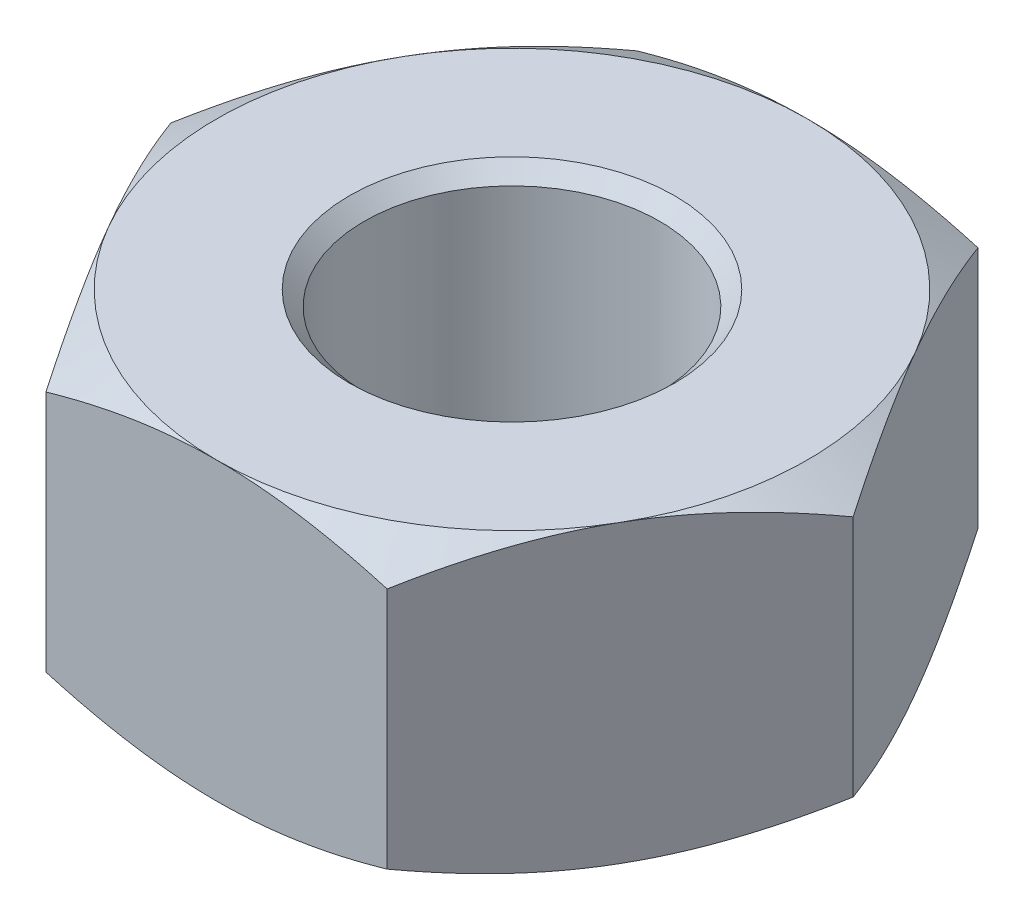
ISO-10303-21;
HEADER;
FILE_DESCRIPTION(('STEP AP214'),'2;1');
FILE_NAME('part.step','',(''),(''),'','','');
FILE_SCHEMA(('AUTOMOTIVE_DESIGN { 1 0 10303 214 1 1 1 1 }'));
ENDSEC;
DATA;
#1=APPLICATION_CONTEXT('core data for automotive mechanical design processes');
#2=APPLICATION_PROTOCOL_DEFINITION('international standard','automotive_design',2000,#1);
#3=PRODUCT_CONTEXT('',#1,'mechanical');
#4=PRODUCT('Part','Part','',(#3));
#5=PRODUCT_RELATED_PRODUCT_CATEGORY('part','',(#4));
#6=PRODUCT_DEFINITION_FORMATION('','',#4);
#7=PRODUCT_DEFINITION_CONTEXT('part definition',#1,'design');
#8=PRODUCT_DEFINITION('design','',#6,#7);
#9=PRODUCT_DEFINITION_SHAPE('','',#8);
#10=(LENGTH_UNIT() NAMED_UNIT(*) SI_UNIT(.MILLI.,.METRE.));
#11=(NAMED_UNIT(*) PLANE_ANGLE_UNIT() SI_UNIT($,.RADIAN.));
#12=(NAMED_UNIT(*) SI_UNIT($,.STERADIAN.) SOLID_ANGLE_UNIT());
#13=UNCERTAINTY_MEASURE_WITH_UNIT(LENGTH_MEASURE(1.E-05),#10,'distance_accuracy_value','');
#14=(GEOMETRIC_REPRESENTATION_CONTEXT(3) GLOBAL_UNCERTAINTY_ASSIGNED_CONTEXT((#13)) GLOBAL_UNIT_ASSIGNED_CONTEXT((#10,
#11,#12)) REPRESENTATION_CONTEXT('',''));
#15=CARTESIAN_POINT('',(0.,0.,0.));
#16=DIRECTION('',(0.,0.,1.));
#17=DIRECTION('',(1.,0.,0.));
#18=AXIS2_PLACEMENT_3D('',#15,#16,#17);
#19=CARTESIAN_POINT('',(0.,1.5,0.));
#20=DIRECTION('',(0.,1.,0.));
#21=DIRECTION('',(0.,0.,1.));
#22=AXIS2_PLACEMENT_3D('',#19,#20,#21);
#23=PLANE('',#22);
#24=CARTESIAN_POINT('',(0.,1.5,0.));
#25=DIRECTION('',(0.,1.,0.));
#26=DIRECTION('',(0.,0.,1.));
#27=AXIS2_PLACEMENT_3D('',#24,#25,#26);
#28=CIRCLE('',#27,0.824999999999999);
#29=CARTESIAN_POINT('',(0.,1.5,0.824999999999999));
#30=VERTEX_POINT('',#29);
#31=EDGE_CURVE('E12',#30,#30,#28,.F.);
#32=ORIENTED_EDGE('',*,*,#31,.T.);
#33=EDGE_LOOP('',(#32));
#34=FACE_BOUND('',#33,.T.);
#35=CARTESIAN_POINT('',(0.,1.5,0.));
#36=DIRECTION('',(0.,1.,0.));
#37=DIRECTION('',(0.,0.,1.));
#38=AXIS2_PLACEMENT_3D('',#35,#36,#37);
#39=CIRCLE('',#38,1.5);
#40=CARTESIAN_POINT('',(-1.29903810567666,1.5,0.750000000000001));
#41=VERTEX_POINT('',#40);
#42=CARTESIAN_POINT('',(0.,1.5,1.5));
#43=VERTEX_POINT('',#42);
#44=EDGE_CURVE('E158',#41,#43,#39,.T.);
#45=ORIENTED_EDGE('',*,*,#44,.T.);
#46=CARTESIAN_POINT('',(1.29903810567666,1.5,0.75));
#47=VERTEX_POINT('',#46);
#48=EDGE_CURVE('E139',#43,#47,#39,.T.);
#49=ORIENTED_EDGE('',*,*,#48,.T.);
#50=CARTESIAN_POINT('',(1.29903810567666,1.5,-0.750000000000001));
#51=VERTEX_POINT('',#50);
#52=EDGE_CURVE('E129',#47,#51,#39,.T.);
#53=ORIENTED_EDGE('',*,*,#52,.T.);
#54=CARTESIAN_POINT('',(0.,1.5,-1.5));
#55=VERTEX_POINT('',#54);
#56=EDGE_CURVE('E55',#51,#55,#39,.T.);
#57=ORIENTED_EDGE('',*,*,#56,.T.);
#58=CARTESIAN_POINT('',(-1.29903810567666,1.5,-0.75));
#59=VERTEX_POINT('',#58);
#60=EDGE_CURVE('E63',#55,#59,#39,.T.);
#61=ORIENTED_EDGE('',*,*,#60,.T.);
#62=EDGE_CURVE('E162',#59,#41,#39,.T.);
#63=ORIENTED_EDGE('',*,*,#62,.T.);
#64=EDGE_LOOP('',(#45,#49,#53,#57,#61,#63));
#65=FACE_BOUND('',#64,.T.);
#66=ADVANCED_FACE('F39',(#34,#65),#23,.T.);
#67=CARTESIAN_POINT('',(0.866025403784439,1.5,1.5));
#68=DIRECTION('',(-0.866025403784439,0.,-0.5));
#69=DIRECTION('',(-0.5,0.,0.866025403784439));
#70=AXIS2_PLACEMENT_3D('',#67,#68,#69);
#71=PLANE('',#70);
#72=CARTESIAN_POINT('',(0.865909933730601,1.36595873045155,1.5002));
#73=CARTESIAN_POINT('',(0.903968454193446,1.38794254723082,1.43428070889745));
#74=CARTESIAN_POINT('',(0.942355490953073,1.40793651431818,1.36779241087777));
#75=CARTESIAN_POINT('',(1.01979436916421,1.44283730281549,1.23366433933493));
#76=CARTESIAN_POINT('',(1.05884758728358,1.45773177567683,1.16602218135312));
#77=CARTESIAN_POINT('',(1.13646999803241,1.48091872268976,1.03157622213016));
#78=CARTESIAN_POINT('',(1.17502724286933,1.48936549228819,0.964793115072754));
#79=CARTESIAN_POINT('',(1.25232329150577,1.49945182648815,0.830912431610121));
#80=CARTESIAN_POINT('',(1.29106181408333,1.50109974064211,0.763815342295623));
#81=CARTESIAN_POINT('',(1.363455807133,1.4976837809469,0.638425268170805));
#82=CARTESIAN_POINT('',(1.39712207785428,1.49345864477602,0.580113576780181));
#83=CARTESIAN_POINT('',(1.46423526865157,1.48006362856733,0.463870120461218));
#84=CARTESIAN_POINT('',(1.49768195634505,1.47088916638415,0.405938758031215));
#85=CARTESIAN_POINT('',(1.56493368410116,1.44795222004501,0.289455348660848));
#86=CARTESIAN_POINT('',(1.59873020609217,1.43409244183855,0.230918055453308));
#87=CARTESIAN_POINT('',(1.6658189879754,1.40263561976334,0.11471687661364));
#88=CARTESIAN_POINT('',(1.699112108342,1.38504597411039,0.0570515005961889));
#89=CARTESIAN_POINT('',(1.73216627762272,1.36595873045155,-0.000200000000000637));
#90=B_SPLINE_CURVE_WITH_KNOTS('',3,(#72,#73,#74,#75,#76,#77,#78,#79,#80,#81,#82,#83,#84,#85,#86,
#87,#88,#89),.UNSPECIFIED.,.F.,.F.,(4,2,2,2,2,2,2,2,4),(0.,0.237777822177384,0.476127422841919,
0.70857706723059,0.940741159251581,1.14294352835891,1.34533342091876,1.55221450553907,
1.75868901573748),.UNSPECIFIED.);
#91=CARTESIAN_POINT('',(0.86602540378444,1.36602540378444,1.5));
#92=VERTEX_POINT('',#91);
#93=EDGE_CURVE('E144',#92,#47,#90,.T.);
#94=ORIENTED_EDGE('',*,*,#93,.F.);
#95=DIRECTION('',(0.,-1.,0.));
#96=VECTOR('',#95,1.);
#97=CARTESIAN_POINT('',(0.866025403784439,1.5,1.5));
#98=LINE('',#97,#96);
#99=CARTESIAN_POINT('',(0.866025403784439,0.133974596215562,1.5));
#100=VERTEX_POINT('',#99);
#101=EDGE_CURVE('E355',#92,#100,#98,.T.);
#102=ORIENTED_EDGE('',*,*,#101,.T.);
#103=CARTESIAN_POINT('',(0.865909933730601,0.13404126954845,1.5002));
#104=CARTESIAN_POINT('',(0.903968454193446,0.112057452769178,1.43428070889745));
#105=CARTESIAN_POINT('',(0.942355490953073,0.0920634856818228,1.36779241087777));
#106=CARTESIAN_POINT('',(1.01979436916421,0.0571626971845069,1.23366433933493));
#107=CARTESIAN_POINT('',(1.05884758728358,0.042268224323167,1.16602218135312));
#108=CARTESIAN_POINT('',(1.13646999803241,0.0190812773102432,1.03157622213016));
#109=CARTESIAN_POINT('',(1.17502724286933,0.0106345077118148,0.964793115072754));
#110=CARTESIAN_POINT('',(1.25232329150577,0.00054817351185309,0.830912431610121));
#111=CARTESIAN_POINT('',(1.29106181408333,-0.00109974064210923,0.763815342295623));
#112=CARTESIAN_POINT('',(1.363455807133,0.00231621905310439,0.638425268170805));
#113=CARTESIAN_POINT('',(1.39712207785428,0.00654135522397997,0.580113576780181));
#114=CARTESIAN_POINT('',(1.46423526865157,0.019936371432671,0.463870120461218));
#115=CARTESIAN_POINT('',(1.49768195634505,0.029110833615848,0.405938758031215));
#116=CARTESIAN_POINT('',(1.56493368410116,0.0520477799549944,0.289455348660848));
#117=CARTESIAN_POINT('',(1.59873020609217,0.0659075581614456,0.230918055453308));
#118=CARTESIAN_POINT('',(1.6658189879754,0.0973643802366553,0.11471687661364));
#119=CARTESIAN_POINT('',(1.699112108342,0.114954025889615,0.0570515005961888));
#120=CARTESIAN_POINT('',(1.73216627762272,0.13404126954845,-0.000200000000000631));
#121=B_SPLINE_CURVE_WITH_KNOTS('',3,(#103,#104,#105,#106,#107,#108,#109,#110,#111,#112,#113,
#114,#115,#116,#117,#118,#119,#120),.UNSPECIFIED.,.F.,.F.,(4,2,2,2,2,2,2,2,4),(0.,
0.237777822177384,0.476127422841919,0.70857706723059,0.940741159251581,1.14294352835891,
1.34533342091876,1.55221450553907,1.75868901573748),.UNSPECIFIED.);
#122=CARTESIAN_POINT('',(1.29903810567666,0.,0.75));
#123=VERTEX_POINT('',#122);
#124=EDGE_CURVE('E329',#100,#123,#121,.T.);
#125=ORIENTED_EDGE('',*,*,#124,.T.);
#126=CARTESIAN_POINT('',(1.73205080756888,0.133974596215561,0.));
#127=VERTEX_POINT('',#126);
#128=EDGE_CURVE('E354',#123,#127,#121,.T.);
#129=ORIENTED_EDGE('',*,*,#128,.T.);
#130=DIRECTION('',(0.,-1.,0.));
#131=VECTOR('',#130,1.);
#132=CARTESIAN_POINT('',(1.73205080756888,1.5,0.));
#133=LINE('',#132,#131);
#134=CARTESIAN_POINT('',(1.73205080756888,1.36602540378444,0.));
#135=VERTEX_POINT('',#134);
#136=EDGE_CURVE('E155',#135,#127,#133,.T.);
#137=ORIENTED_EDGE('',*,*,#136,.F.);
#138=EDGE_CURVE('E133',#47,#135,#90,.T.);
#139=ORIENTED_EDGE('',*,*,#138,.F.);
#140=EDGE_LOOP('',(#94,#102,#125,#129,#137,#139));
#141=FACE_BOUND('',#140,.T.);
#142=ADVANCED_FACE('F153',(#141),#71,.F.);
#143=CARTESIAN_POINT('',(1.73205080756888,1.5,0.));
#144=DIRECTION('',(-0.866025403784439,0.,0.5));
#145=DIRECTION('',(0.5,0.,0.866025403784439));
#146=AXIS2_PLACEMENT_3D('',#143,#144,#145);
#147=PLANE('',#146);
#148=CARTESIAN_POINT('',(1.73216627762272,1.36595873045155,0.000199999999999588));
#149=CARTESIAN_POINT('',(1.69410775715987,1.38794254723082,-0.0657192911025481));
#150=CARTESIAN_POINT('',(1.65572072040024,1.40793651431818,-0.132207589122235));
#151=CARTESIAN_POINT('',(1.5782818421891,1.44283730281549,-0.266335660665071));
#152=CARTESIAN_POINT('',(1.53922862406973,1.45773177567683,-0.333977818646887));
#153=CARTESIAN_POINT('',(1.4616062133209,1.48091872268976,-0.468423777869844));
#154=CARTESIAN_POINT('',(1.42304896848399,1.48936549228819,-0.535206884927248));
#155=CARTESIAN_POINT('',(1.34575291984755,1.49945182648815,-0.669087568389881));
#156=CARTESIAN_POINT('',(1.30701439726998,1.50109974064211,-0.736184657704379));
#157=CARTESIAN_POINT('',(1.23462040422031,1.4976837809469,-0.861574731829196));
#158=CARTESIAN_POINT('',(1.20095413349903,1.49345864477602,-0.91988642321982));
#159=CARTESIAN_POINT('',(1.13384094270175,1.48006362856733,-1.03612987953878));
#160=CARTESIAN_POINT('',(1.10039425500826,1.47088916638415,-1.09406124196879));
#161=CARTESIAN_POINT('',(1.03314252725216,1.44795222004501,-1.21054465133915));
#162=CARTESIAN_POINT('',(0.999346005261151,1.43409244183855,-1.26908194454669));
#163=CARTESIAN_POINT('',(0.932257223377916,1.40263561976334,-1.38528312338636));
#164=CARTESIAN_POINT('',(0.89896410301132,1.38504597411038,-1.44294849940381));
#165=CARTESIAN_POINT('',(0.8659099337306,1.36595873045155,-1.5002));
#166=B_SPLINE_CURVE_WITH_KNOTS('',3,(#148,#149,#150,#151,#152,#153,#154,#155,#156,#157,#158,
#159,#160,#161,#162,#163,#164,#165),.UNSPECIFIED.,.F.,.F.,(4,2,2,2,2,2,2,2,4),(0.,
0.237777822177383,0.476127422841919,0.70857706723059,0.94074115925158,1.14294352835891,
1.34533342091876,1.55221450553907,1.75868901573748),.UNSPECIFIED.);
#167=EDGE_CURVE('E135',#135,#51,#166,.T.);
#168=ORIENTED_EDGE('',*,*,#167,.F.);
#169=ORIENTED_EDGE('',*,*,#136,.T.);
#170=CARTESIAN_POINT('',(1.73216627762272,0.13404126954845,0.000199999999999522));
#171=CARTESIAN_POINT('',(1.69410775715987,0.112057452769178,-0.0657192911025481));
#172=CARTESIAN_POINT('',(1.65572072040024,0.0920634856818224,-0.132207589122235));
#173=CARTESIAN_POINT('',(1.5782818421891,0.0571626971845065,-0.266335660665071));
#174=CARTESIAN_POINT('',(1.53922862406973,0.0422682243231666,-0.333977818646887));
#175=CARTESIAN_POINT('',(1.4616062133209,0.0190812773102429,-0.468423777869844));
#176=CARTESIAN_POINT('',(1.42304896848399,0.0106345077118145,-0.535206884927248));
#177=CARTESIAN_POINT('',(1.34575291984755,0.000548173511853067,-0.669087568389881));
#178=CARTESIAN_POINT('',(1.30701439726998,-0.00109974064210917,-0.736184657704379));
#179=CARTESIAN_POINT('',(1.23462040422031,0.00231621905310457,-0.861574731829196));
#180=CARTESIAN_POINT('',(1.20095413349903,0.0065413552239802,-0.91988642321982));
#181=CARTESIAN_POINT('',(1.13384094270175,0.0199363714326713,-1.03612987953878));
#182=CARTESIAN_POINT('',(1.10039425500826,0.0291108336158483,-1.09406124196879));
#183=CARTESIAN_POINT('',(1.03314252725216,0.0520477799549946,-1.21054465133915));
#184=CARTESIAN_POINT('',(0.999346005261151,0.0659075581614459,-1.26908194454669));
#185=CARTESIAN_POINT('',(0.932257223377917,0.0973643802366556,-1.38528312338636));
#186=CARTESIAN_POINT('',(0.89896410301132,0.114954025889615,-1.44294849940381));
#187=CARTESIAN_POINT('',(0.8659099337306,0.13404126954845,-1.5002));
#188=B_SPLINE_CURVE_WITH_KNOTS('',3,(#170,#171,#172,#173,#174,#175,#176,#177,#178,#179,#180,
#181,#182,#183,#184,#185,#186,#187),.UNSPECIFIED.,.F.,.F.,(4,2,2,2,2,2,2,2,4),(0.,
0.237777822177383,0.476127422841919,0.70857706723059,0.94074115925158,1.1429435283589,
1.34533342091876,1.55221450553907,1.75868901573748),.UNSPECIFIED.);
#189=CARTESIAN_POINT('',(1.29903810567666,0.,-0.750000000000001));
#190=VERTEX_POINT('',#189);
#191=EDGE_CURVE('E353',#127,#190,#188,.T.);
#192=ORIENTED_EDGE('',*,*,#191,.T.);
#193=CARTESIAN_POINT('',(0.866025403784438,0.133974596215561,-1.5));
#194=VERTEX_POINT('',#193);
#195=EDGE_CURVE('E276',#190,#194,#188,.T.);
#196=ORIENTED_EDGE('',*,*,#195,.T.);
#197=DIRECTION('',(0.,-1.,0.));
#198=VECTOR('',#197,1.);
#199=CARTESIAN_POINT('',(0.866025403784438,1.5,-1.5));
#200=LINE('',#199,#198);
#201=CARTESIAN_POINT('',(0.866025403784438,1.36602540378444,-1.5));
#202=VERTEX_POINT('',#201);
#203=EDGE_CURVE('E308',#202,#194,#200,.T.);
#204=ORIENTED_EDGE('',*,*,#203,.F.);
#205=EDGE_CURVE('E294',#51,#202,#166,.T.);
#206=ORIENTED_EDGE('',*,*,#205,.F.);
#207=EDGE_LOOP('',(#168,#169,#192,#196,#204,#206));
#208=FACE_BOUND('',#207,.T.);
#209=ADVANCED_FACE('F286',(#208),#147,.F.);
#210=CARTESIAN_POINT('',(0.866025403784438,1.5,-1.5));
#211=DIRECTION('',(0.,0.,1.));
#212=DIRECTION('',(1.,0.,0.));
#213=AXIS2_PLACEMENT_3D('',#210,#211,#212);
#214=PLANE('',#213);
#215=CARTESIAN_POINT('',(3.15751325126236,0.347784426109629,-1.5));
#216=CARTESIAN_POINT('',(3.08438955465262,0.385914760831103,-1.5));
#217=CARTESIAN_POINT('',(3.01116831736562,0.423859106036614,-1.5));
#218=CARTESIAN_POINT('',(2.86448546580534,0.499285148944576,-1.5));
#219=CARTESIAN_POINT('',(2.79102384485441,0.536766833654283,-1.5));
#220=CARTESIAN_POINT('',(2.56999810246575,0.648489143900354,-1.5));
#221=CARTESIAN_POINT('',(2.42200993826517,0.721893274372643,-1.5));
#222=CARTESIAN_POINT('',(2.11601850981681,0.869368323921755,-1.5));
#223=CARTESIAN_POINT('',(1.9579199961067,0.943244659302652,-1.5));
#224=CARTESIAN_POINT('',(1.7186966679617,1.04929255048478,-1.5));
#225=CARTESIAN_POINT('',(1.63862902596388,1.08383972068041,-1.5));
#226=CARTESIAN_POINT('',(1.47761543153087,1.1508138069957,-1.5));
#227=CARTESIAN_POINT('',(1.39666956277652,1.1832409230892,-1.5));
#228=CARTESIAN_POINT('',(1.22404158486874,1.2489495315042,-1.5));
#229=CARTESIAN_POINT('',(1.13222318053757,1.28187749434387,-1.5));
#230=CARTESIAN_POINT('',(0.946917584255699,1.34281902292776,-1.5));
#231=CARTESIAN_POINT('',(0.853430043140595,1.37083154682723,-1.5));
#232=CARTESIAN_POINT('',(0.666558303541503,1.41953949065209,-1.5));
#233=CARTESIAN_POINT('',(0.573210999614842,1.44037268302106,-1.5));
#234=CARTESIAN_POINT('',(0.385038841169345,1.47341497103652,-1.5));
#235=CARTESIAN_POINT('',(0.290215536471697,1.48563256117434,-1.5));
#236=CARTESIAN_POINT('',(0.0981035248175211,1.49991792402601,-1.5));
#237=CARTESIAN_POINT('',(0.000800663264771196,1.50180495321097,-1.5));
#238=CARTESIAN_POINT('',(-0.193397276597482,1.49462939832095,-1.5));
#239=CARTESIAN_POINT('',(-0.290292272193177,1.48556469138122,-1.5));
#240=CARTESIAN_POINT('',(-0.484721017863885,1.45757211551645,-1.5));
#241=CARTESIAN_POINT('',(-0.582223417297039,1.43843559071773,-1.5));
#242=CARTESIAN_POINT('',(-0.775385424565413,1.39246628892592,-1.5));
#243=CARTESIAN_POINT('',(-0.871044079569862,1.36562964066456,-1.5));
#244=CARTESIAN_POINT('',(-1.06467792985573,1.3051103153819,-1.5));
#245=CARTESIAN_POINT('',(-1.16257473108971,1.27118201421167,-1.5));
#246=CARTESIAN_POINT('',(-1.35680112378689,1.19906606851655,-1.5));
#247=CARTESIAN_POINT('',(-1.45313014564293,1.16087691384528,-1.5));
#248=CARTESIAN_POINT('',(-1.64466020625076,1.08144130615725,-1.5));
#249=CARTESIAN_POINT('',(-1.73985954492454,1.04019079168216,-1.5));
#250=CARTESIAN_POINT('',(-1.92929018213505,0.955520629079334,-1.5));
#251=CARTESIAN_POINT('',(-2.02352141522582,0.912100835452057,-1.5));
#252=CARTESIAN_POINT('',(-2.20523239659553,0.826493438183439,-1.5));
#253=CARTESIAN_POINT('',(-2.29275878521205,0.784404400856171,-1.5));
#254=CARTESIAN_POINT('',(-2.46729204901473,0.699155272640639,-1.5));
#255=CARTESIAN_POINT('',(-2.55429890082375,0.655995134000857,-1.5));
#256=CARTESIAN_POINT('',(-2.72753423395516,0.5690264808437,-1.5));
#257=CARTESIAN_POINT('',(-2.81376444748835,0.525221408552819,-1.5));
#258=CARTESIAN_POINT('',(-2.98587795784647,0.436955306396783,-1.5));
#259=CARTESIAN_POINT('',(-3.07176128821317,0.392494341985709,-1.5));
#260=CARTESIAN_POINT('',(-3.15751325126236,0.347784426109628,-1.5));
#261=B_SPLINE_CURVE_WITH_KNOTS('',3,(#215,#216,#217,#218,#219,#220,#221,#222,#223,#224,#225,
#226,#227,#228,#229,#230,#231,#232,#233,#234,#235,#236,#237,#238,#239,#240,#241,#242,#243,#244,
#245,#246,#247,#248,#249,#250,#251,#252,#253,#254,#255,#256,#257,#258,#259,#260),.UNSPECIFIED.,
.F.,.F.,(4,2,2,2,2,2,2,2,2,2,2,2,2,2,2,2,2,2,2,2,2,2,4),(0.,0.247404862399332,0.494816656854908,
0.990374758800301,1.5137972498674,1.77538342459082,2.03694488952544,2.32947930025892,
2.6220756400019,2.90869537352049,3.19503211976132,3.48636297655011,3.77775031344735,
4.07542671934006,4.37325304627389,4.68394279543554,4.99474301223937,5.30596319916494,
5.61720428858481,5.90855627076937,6.19992126533772,6.49007473952391,6.78019945143157),.UNSPECIFIED.);
#262=EDGE_CURVE('E299',#202,#55,#261,.T.);
#263=ORIENTED_EDGE('',*,*,#262,.F.);
#264=ORIENTED_EDGE('',*,*,#203,.T.);
#265=CARTESIAN_POINT('',(3.15751325126236,1.15221557389037,-1.5));
#266=CARTESIAN_POINT('',(3.08438955465262,1.1140852391689,-1.5));
#267=CARTESIAN_POINT('',(3.01116831736562,1.07614089396339,-1.5));
#268=CARTESIAN_POINT('',(2.86448546580534,1.00071485105542,-1.5));
#269=CARTESIAN_POINT('',(2.79102384485441,0.963233166345718,-1.5));
#270=CARTESIAN_POINT('',(2.56999810246576,0.851510856099647,-1.5));
#271=CARTESIAN_POINT('',(2.42200993826517,0.778106725627358,-1.5));
#272=CARTESIAN_POINT('',(2.11601850981681,0.630631676078246,-1.5));
#273=CARTESIAN_POINT('',(1.9579199961067,0.556755340697349,-1.5));
#274=CARTESIAN_POINT('',(1.7186966679617,0.450707449515218,-1.5));
#275=CARTESIAN_POINT('',(1.63862902596388,0.416160279319591,-1.5));
#276=CARTESIAN_POINT('',(1.47761543153087,0.349186193004303,-1.5));
#277=CARTESIAN_POINT('',(1.39666956277653,0.316759076910798,-1.5));
#278=CARTESIAN_POINT('',(1.22404158486874,0.251050468495802,-1.5));
#279=CARTESIAN_POINT('',(1.13222318053757,0.218122505656133,-1.5));
#280=CARTESIAN_POINT('',(0.946917584255701,0.157180977072243,-1.5));
#281=CARTESIAN_POINT('',(0.853430043140597,0.129168453172767,-1.5));
#282=CARTESIAN_POINT('',(0.666558303541505,0.0804605093479099,-1.5));
#283=CARTESIAN_POINT('',(0.573210999614844,0.0596273169789383,-1.5));
#284=CARTESIAN_POINT('',(0.385038841169347,0.0265850289634785,-1.5));
#285=CARTESIAN_POINT('',(0.290215536471699,0.0143674388256556,-1.5));
#286=CARTESIAN_POINT('',(0.0981035248175236,8.2075973985087E-05,-1.5));
#287=CARTESIAN_POINT('',(0.000800663264773744,-0.00180495321096528,-1.5));
#288=CARTESIAN_POINT('',(-0.19339727659748,0.00537060167905476,-1.5));
#289=CARTESIAN_POINT('',(-0.290292272193175,0.0144353086187769,-1.5));
#290=CARTESIAN_POINT('',(-0.484721017863883,0.042427884483553,-1.5));
#291=CARTESIAN_POINT('',(-0.582223417297037,0.0615644092822655,-1.5));
#292=CARTESIAN_POINT('',(-0.775385424565411,0.107533711074078,-1.5));
#293=CARTESIAN_POINT('',(-0.87104407956986,0.134370359335436,-1.5));
#294=CARTESIAN_POINT('',(-1.06467792985573,0.194889684618097,-1.5));
#295=CARTESIAN_POINT('',(-1.16257473108971,0.228817985788324,-1.5));
#296=CARTESIAN_POINT('',(-1.35680112378689,0.300933931483445,-1.5));
#297=CARTESIAN_POINT('',(-1.45313014564293,0.339123086154721,-1.5));
#298=CARTESIAN_POINT('',(-1.64466020625076,0.418558693842748,-1.5));
#299=CARTESIAN_POINT('',(-1.73985954492454,0.459809208317837,-1.5));
#300=CARTESIAN_POINT('',(-1.92929018213505,0.544479370920665,-1.5));
#301=CARTESIAN_POINT('',(-2.02352141522582,0.587899164547943,-1.5));
#302=CARTESIAN_POINT('',(-2.20523239659553,0.673506561816561,-1.5));
#303=CARTESIAN_POINT('',(-2.29275878521205,0.715595599143829,-1.5));
#304=CARTESIAN_POINT('',(-2.46729204901473,0.800844727359361,-1.5));
#305=CARTESIAN_POINT('',(-2.55429890082375,0.844004865999143,-1.5));
#306=CARTESIAN_POINT('',(-2.72753423395516,0.930973519156301,-1.5));
#307=CARTESIAN_POINT('',(-2.81376444748835,0.974778591447181,-1.5));
#308=CARTESIAN_POINT('',(-2.98587795784647,1.06304469360322,-1.5));
#309=CARTESIAN_POINT('',(-3.07176128821317,1.10750565801429,-1.5));
#310=CARTESIAN_POINT('',(-3.15751325126236,1.15221557389037,-1.5));
#311=B_SPLINE_CURVE_WITH_KNOTS('',3,(#265,#266,#267,#268,#269,#270,#271,#272,#273,#274,#275,
#276,#277,#278,#279,#280,#281,#282,#283,#284,#285,#286,#287,#288,#289,#290,#291,#292,#293,#294,
#295,#296,#297,#298,#299,#300,#301,#302,#303,#304,#305,#306,#307,#308,#309,#310),.UNSPECIFIED.,
.F.,.F.,(4,2,2,2,2,2,2,2,2,2,2,2,2,2,2,2,2,2,2,2,2,2,4),(0.,0.247404862399332,0.494816656854907,
0.9903747588003,1.5137972498674,1.77538342459082,2.03694488952544,2.32947930025892,
2.6220756400019,2.90869537352048,3.19503211976132,3.48636297655011,3.77775031344735,
4.07542671934006,4.37325304627389,4.68394279543554,4.99474301223937,5.30596319916494,
5.61720428858481,5.90855627076937,6.19992126533772,6.49007473952391,6.78019945143157),.UNSPECIFIED.);
#312=CARTESIAN_POINT('',(0.,0.,-1.5));
#313=VERTEX_POINT('',#312);
#314=EDGE_CURVE('E275',#194,#313,#311,.T.);
#315=ORIENTED_EDGE('',*,*,#314,.T.);
#316=CARTESIAN_POINT('',(-0.866025403784439,0.133974596215562,-1.5));
#317=VERTEX_POINT('',#316);
#318=EDGE_CURVE('E268',#313,#317,#311,.T.);
#319=ORIENTED_EDGE('',*,*,#318,.T.);
#320=DIRECTION('',(0.,-1.,0.));
#321=VECTOR('',#320,1.);
#322=CARTESIAN_POINT('',(-0.866025403784439,1.5,-1.5));
#323=LINE('',#322,#321);
#324=CARTESIAN_POINT('',(-0.866025403784439,1.36602540378444,-1.5));
#325=VERTEX_POINT('',#324);
#326=EDGE_CURVE('E303',#325,#317,#323,.T.);
#327=ORIENTED_EDGE('',*,*,#326,.F.);
#328=EDGE_CURVE('E174',#55,#325,#261,.T.);
#329=ORIENTED_EDGE('',*,*,#328,.F.);
#330=EDGE_LOOP('',(#263,#264,#315,#319,#327,#329));
#331=FACE_BOUND('',#330,.T.);
#332=ADVANCED_FACE('F283',(#331),#214,.F.);
#333=CARTESIAN_POINT('',(-0.866025403784439,1.5,-1.5));
#334=DIRECTION('',(0.866025403784439,0.,0.5));
#335=DIRECTION('',(0.5,0.,-0.866025403784439));
#336=AXIS2_PLACEMENT_3D('',#333,#334,#335);
#337=PLANE('',#336);
#338=CARTESIAN_POINT('',(-0.865909933730602,1.36595873045155,-1.5002));
#339=CARTESIAN_POINT('',(-0.903968454193447,1.38794254723082,-1.43428070889745));
#340=CARTESIAN_POINT('',(-0.942355490953073,1.40793651431818,-1.36779241087777));
#341=CARTESIAN_POINT('',(-1.01979436916421,1.44283730281549,-1.23366433933493));
#342=CARTESIAN_POINT('',(-1.05884758728358,1.45773177567683,-1.16602218135312));
#343=CARTESIAN_POINT('',(-1.13646999803241,1.48091872268976,-1.03157622213016));
#344=CARTESIAN_POINT('',(-1.17502724286933,1.48936549228818,-0.964793115072753));
#345=CARTESIAN_POINT('',(-1.25232329150577,1.49945182648815,-0.830912431610121));
#346=CARTESIAN_POINT('',(-1.29106181408333,1.50109974064211,-0.763815342295623));
#347=CARTESIAN_POINT('',(-1.36345580713301,1.4976837809469,-0.638425268170805));
#348=CARTESIAN_POINT('',(-1.39712207785428,1.49345864477602,-0.580113576780181));
#349=CARTESIAN_POINT('',(-1.46423526865157,1.48006362856733,-0.463870120461218));
#350=CARTESIAN_POINT('',(-1.49768195634505,1.47088916638415,-0.405938758031215));
#351=CARTESIAN_POINT('',(-1.56493368410116,1.44795222004501,-0.289455348660848));
#352=CARTESIAN_POINT('',(-1.59873020609217,1.43409244183855,-0.230918055453308));
#353=CARTESIAN_POINT('',(-1.6658189879754,1.40263561976334,-0.11471687661364));
#354=CARTESIAN_POINT('',(-1.699112108342,1.38504597411039,-0.0570515005961888));
#355=CARTESIAN_POINT('',(-1.73216627762272,1.36595873045155,0.000200000000000599));
#356=B_SPLINE_CURVE_WITH_KNOTS('',3,(#338,#339,#340,#341,#342,#343,#344,#345,#346,#347,#348,
#349,#350,#351,#352,#353,#354,#355),.UNSPECIFIED.,.F.,.F.,(4,2,2,2,2,2,2,2,4),(0.,
0.237777822177384,0.476127422841919,0.708577067230591,0.940741159251581,1.14294352835891,
1.34533342091876,1.55221450553907,1.75868901573748),.UNSPECIFIED.);
#357=EDGE_CURVE('E171',#325,#59,#356,.T.);
#358=ORIENTED_EDGE('',*,*,#357,.F.);
#359=ORIENTED_EDGE('',*,*,#326,.T.);
#360=CARTESIAN_POINT('',(-0.865909933730602,0.134041269548451,-1.5002));
#361=CARTESIAN_POINT('',(-0.903968454193447,0.112057452769178,-1.43428070889745));
#362=CARTESIAN_POINT('',(-0.942355490953073,0.092063485681823,-1.36779241087777));
#363=CARTESIAN_POINT('',(-1.01979436916421,0.0571626971845072,-1.23366433933493));
#364=CARTESIAN_POINT('',(-1.05884758728358,0.0422682243231672,-1.16602218135312));
#365=CARTESIAN_POINT('',(-1.13646999803241,0.0190812773102434,-1.03157622213016));
#366=CARTESIAN_POINT('',(-1.17502724286933,0.010634507711815,-0.964793115072754));
#367=CARTESIAN_POINT('',(-1.25232329150577,0.000548173511853393,-0.830912431610121));
#368=CARTESIAN_POINT('',(-1.29106181408333,-0.00109974064210883,-0.763815342295623));
#369=CARTESIAN_POINT('',(-1.36345580713301,0.00231621905310486,-0.638425268170805));
#370=CARTESIAN_POINT('',(-1.39712207785428,0.00654135522398041,-0.580113576780181));
#371=CARTESIAN_POINT('',(-1.46423526865157,0.0199363714326714,-0.463870120461218));
#372=CARTESIAN_POINT('',(-1.49768195634505,0.0291108336158485,-0.405938758031215));
#373=CARTESIAN_POINT('',(-1.56493368410116,0.0520477799549949,-0.289455348660848));
#374=CARTESIAN_POINT('',(-1.59873020609217,0.0659075581614462,-0.230918055453308));
#375=CARTESIAN_POINT('',(-1.6658189879754,0.0973643802366558,-0.11471687661364));
#376=CARTESIAN_POINT('',(-1.699112108342,0.114954025889615,-0.057051500596189));
#377=CARTESIAN_POINT('',(-1.73216627762272,0.13404126954845,0.000200000000000602));
#378=B_SPLINE_CURVE_WITH_KNOTS('',3,(#360,#361,#362,#363,#364,#365,#366,#367,#368,#369,#370,
#371,#372,#373,#374,#375,#376,#377),.UNSPECIFIED.,.F.,.F.,(4,2,2,2,2,2,2,2,4),(0.,
0.237777822177384,0.476127422841919,0.708577067230591,0.940741159251581,1.14294352835891,
1.34533342091876,1.55221450553907,1.75868901573748),.UNSPECIFIED.);
#379=CARTESIAN_POINT('',(-1.29903810567666,0.,-0.75));
#380=VERTEX_POINT('',#379);
#381=EDGE_CURVE('E267',#317,#380,#378,.T.);
#382=ORIENTED_EDGE('',*,*,#381,.T.);
#383=CARTESIAN_POINT('',(-1.73205080756888,0.133974596215561,0.));
#384=VERTEX_POINT('',#383);
#385=EDGE_CURVE('E261',#380,#384,#378,.T.);
#386=ORIENTED_EDGE('',*,*,#385,.T.);
#387=DIRECTION('',(0.,-1.,0.));
#388=VECTOR('',#387,1.);
#389=CARTESIAN_POINT('',(-1.73205080756888,1.5,0.));
#390=LINE('',#389,#388);
#391=CARTESIAN_POINT('',(-1.73205080756888,1.36602540378444,0.));
#392=VERTEX_POINT('',#391);
#393=EDGE_CURVE('E181',#392,#384,#390,.T.);
#394=ORIENTED_EDGE('',*,*,#393,.F.);
#395=EDGE_CURVE('E167',#59,#392,#356,.T.);
#396=ORIENTED_EDGE('',*,*,#395,.F.);
#397=EDGE_LOOP('',(#358,#359,#382,#386,#394,#396));
#398=FACE_BOUND('',#397,.T.);
#399=ADVANCED_FACE('F179',(#398),#337,.F.);
#400=CARTESIAN_POINT('',(-1.73205080756888,1.5,0.));
#401=DIRECTION('',(0.866025403784438,0.,-0.5));
#402=DIRECTION('',(-0.5,0.,-0.866025403784439));
#403=AXIS2_PLACEMENT_3D('',#400,#401,#402);
#404=PLANE('',#403);
#405=CARTESIAN_POINT('',(-1.73216627762272,1.36595873045155,-0.00019999999999941));
#406=CARTESIAN_POINT('',(-1.69410775715987,1.38794254723082,0.0657192911025481));
#407=CARTESIAN_POINT('',(-1.65572072040024,1.40793651431818,0.132207589122236));
#408=CARTESIAN_POINT('',(-1.5782818421891,1.44283730281549,0.266335660665071));
#409=CARTESIAN_POINT('',(-1.53922862406974,1.45773177567683,0.333977818646887));
#410=CARTESIAN_POINT('',(-1.4616062133209,1.48091872268976,0.468423777869844));
#411=CARTESIAN_POINT('',(-1.42304896848399,1.48936549228818,0.535206884927248));
#412=CARTESIAN_POINT('',(-1.34575291984755,1.49945182648815,0.669087568389881));
#413=CARTESIAN_POINT('',(-1.30701439726998,1.50109974064211,0.736184657704379));
#414=CARTESIAN_POINT('',(-1.23462040422031,1.49768378094689,0.861574731829196));
#415=CARTESIAN_POINT('',(-1.20095413349903,1.49345864477602,0.919886423219821));
#416=CARTESIAN_POINT('',(-1.13384094270175,1.48006362856733,1.03612987953878));
#417=CARTESIAN_POINT('',(-1.10039425500826,1.47088916638415,1.09406124196879));
#418=CARTESIAN_POINT('',(-1.03314252725216,1.44795222004501,1.21054465133915));
#419=CARTESIAN_POINT('',(-0.999346005261152,1.43409244183855,1.26908194454669));
#420=CARTESIAN_POINT('',(-0.932257223377918,1.40263561976334,1.38528312338636));
#421=CARTESIAN_POINT('',(-0.898964103011322,1.38504597411038,1.44294849940381));
#422=CARTESIAN_POINT('',(-0.865909933730602,1.36595873045155,1.5002));
#423=B_SPLINE_CURVE_WITH_KNOTS('',3,(#405,#406,#407,#408,#409,#410,#411,#412,#413,#414,#415,
#416,#417,#418,#419,#420,#421,#422),.UNSPECIFIED.,.F.,.F.,(4,2,2,2,2,2,2,2,4),(0.,
0.237777822177383,0.476127422841919,0.70857706723059,0.940741159251581,1.14294352835891,
1.34533342091876,1.55221450553907,1.75868901573748),.UNSPECIFIED.);
#424=EDGE_CURVE('E160',#392,#41,#423,.T.);
#425=ORIENTED_EDGE('',*,*,#424,.F.);
#426=ORIENTED_EDGE('',*,*,#393,.T.);
#427=CARTESIAN_POINT('',(-1.73216627762272,0.13404126954845,-0.00019999999999941));
#428=CARTESIAN_POINT('',(-1.69410775715987,0.112057452769178,0.0657192911025483));
#429=CARTESIAN_POINT('',(-1.65572072040024,0.0920634856818227,0.132207589122236));
#430=CARTESIAN_POINT('',(-1.5782818421891,0.057162697184507,0.266335660665071));
#431=CARTESIAN_POINT('',(-1.53922862406974,0.0422682243231672,0.333977818646887));
#432=CARTESIAN_POINT('',(-1.4616062133209,0.0190812773102435,0.468423777869844));
#433=CARTESIAN_POINT('',(-1.42304896848399,0.0106345077118149,0.535206884927249));
#434=CARTESIAN_POINT('',(-1.34575291984755,0.000548173511853355,0.669087568389881));
#435=CARTESIAN_POINT('',(-1.30701439726998,-0.00109974064210882,0.736184657704379));
#436=CARTESIAN_POINT('',(-1.23462040422031,0.00231621905310496,0.861574731829196));
#437=CARTESIAN_POINT('',(-1.20095413349903,0.00654135522398057,0.91988642321982));
#438=CARTESIAN_POINT('',(-1.13384094270175,0.0199363714326716,1.03612987953878));
#439=CARTESIAN_POINT('',(-1.10039425500826,0.0291108336158487,1.09406124196879));
#440=CARTESIAN_POINT('',(-1.03314252725216,0.0520477799549951,1.21054465133915));
#441=CARTESIAN_POINT('',(-0.999346005261152,0.0659075581614463,1.26908194454669));
#442=CARTESIAN_POINT('',(-0.932257223377918,0.0973643802366558,1.38528312338636));
#443=CARTESIAN_POINT('',(-0.898964103011321,0.114954025889615,1.44294849940381));
#444=CARTESIAN_POINT('',(-0.865909933730602,0.13404126954845,1.5002));
#445=B_SPLINE_CURVE_WITH_KNOTS('',3,(#427,#428,#429,#430,#431,#432,#433,#434,#435,#436,#437,
#438,#439,#440,#441,#442,#443,#444),.UNSPECIFIED.,.F.,.F.,(4,2,2,2,2,2,2,2,4),(0.,
0.237777822177383,0.476127422841919,0.70857706723059,0.940741159251581,1.1429435283589,
1.34533342091876,1.55221450553907,1.75868901573748),.UNSPECIFIED.);
#446=CARTESIAN_POINT('',(-1.29903810567666,0.,0.750000000000001));
#447=VERTEX_POINT('',#446);
#448=EDGE_CURVE('E259',#384,#447,#445,.T.);
#449=ORIENTED_EDGE('',*,*,#448,.T.);
#450=CARTESIAN_POINT('',(-0.866025403784439,0.133974596215561,1.5));
#451=VERTEX_POINT('',#450);
#452=EDGE_CURVE('E252',#447,#451,#445,.T.);
#453=ORIENTED_EDGE('',*,*,#452,.T.);
#454=DIRECTION('',(0.,-1.,0.));
#455=VECTOR('',#454,1.);
#456=CARTESIAN_POINT('',(-0.866025403784439,1.5,1.5));
#457=LINE('',#456,#455);
#458=CARTESIAN_POINT('',(-0.866025403784439,1.36602540378444,1.5));
#459=VERTEX_POINT('',#458);
#460=EDGE_CURVE('E311',#459,#451,#457,.T.);
#461=ORIENTED_EDGE('',*,*,#460,.F.);
#462=EDGE_CURVE('E159',#41,#459,#423,.T.);
#463=ORIENTED_EDGE('',*,*,#462,.F.);
#464=EDGE_LOOP('',(#425,#426,#449,#453,#461,#463));
#465=FACE_BOUND('',#464,.T.);
#466=ADVANCED_FACE('F243',(#465),#404,.F.);
#467=CARTESIAN_POINT('',(-0.866025403784439,1.5,1.5));
#468=DIRECTION('',(0.,0.,-1.));
#469=DIRECTION('',(-1.,0.,0.));
#470=AXIS2_PLACEMENT_3D('',#467,#468,#469);
#471=PLANE('',#470);
#472=CARTESIAN_POINT('',(-3.15751325126236,0.347784426109628,1.5));
#473=CARTESIAN_POINT('',(-3.08438955465262,0.385914760831102,1.5));
#474=CARTESIAN_POINT('',(-3.01116831736562,0.423859106036613,1.5));
#475=CARTESIAN_POINT('',(-2.86448546580535,0.499285148944576,1.5));
#476=CARTESIAN_POINT('',(-2.79102384485441,0.536766833654282,1.5));
#477=CARTESIAN_POINT('',(-2.56999810246576,0.648489143900353,1.5));
#478=CARTESIAN_POINT('',(-2.42200993826517,0.721893274372643,1.5));
#479=CARTESIAN_POINT('',(-2.11601850981681,0.869368323921755,1.5));
#480=CARTESIAN_POINT('',(-1.9579199961067,0.943244659302651,1.5));
#481=CARTESIAN_POINT('',(-1.7186966679617,1.04929255048478,1.5));
#482=CARTESIAN_POINT('',(-1.63862902596388,1.08383972068041,1.5));
#483=CARTESIAN_POINT('',(-1.47761543153087,1.1508138069957,1.5));
#484=CARTESIAN_POINT('',(-1.39666956277653,1.1832409230892,1.5));
#485=CARTESIAN_POINT('',(-1.22404158486874,1.2489495315042,1.5));
#486=CARTESIAN_POINT('',(-1.13222318053757,1.28187749434387,1.5));
#487=CARTESIAN_POINT('',(-0.9469175842557,1.34281902292776,1.5));
#488=CARTESIAN_POINT('',(-0.853430043140596,1.37083154682723,1.5));
#489=CARTESIAN_POINT('',(-0.666558303541503,1.41953949065209,1.5));
#490=CARTESIAN_POINT('',(-0.573210999614843,1.44037268302106,1.5));
#491=CARTESIAN_POINT('',(-0.385038841169346,1.47341497103652,1.5));
#492=CARTESIAN_POINT('',(-0.290215536471698,1.48563256117434,1.5));
#493=CARTESIAN_POINT('',(-0.098103524817522,1.49991792402602,1.5));
#494=CARTESIAN_POINT('',(-0.00080066326477209,1.50180495321097,1.5));
#495=CARTESIAN_POINT('',(0.193397276597481,1.49462939832095,1.5));
#496=CARTESIAN_POINT('',(0.290292272193176,1.48556469138122,1.5));
#497=CARTESIAN_POINT('',(0.484721017863884,1.45757211551645,1.5));
#498=CARTESIAN_POINT('',(0.582223417297038,1.43843559071773,1.5));
#499=CARTESIAN_POINT('',(0.775385424565411,1.39246628892592,1.5));
#500=CARTESIAN_POINT('',(0.871044079569861,1.36562964066456,1.5));
#501=CARTESIAN_POINT('',(1.06467792985573,1.3051103153819,1.5));
#502=CARTESIAN_POINT('',(1.16257473108971,1.27118201421168,1.5));
#503=CARTESIAN_POINT('',(1.35680112378689,1.19906606851655,1.5));
#504=CARTESIAN_POINT('',(1.45313014564293,1.16087691384528,1.5));
#505=CARTESIAN_POINT('',(1.64466020625076,1.08144130615725,1.5));
#506=CARTESIAN_POINT('',(1.73985954492454,1.04019079168216,1.5));
#507=CARTESIAN_POINT('',(1.92929018213505,0.955520629079334,1.5));
#508=CARTESIAN_POINT('',(2.02352141522582,0.912100835452057,1.5));
#509=CARTESIAN_POINT('',(2.20523239659553,0.826493438183439,1.5));
#510=CARTESIAN_POINT('',(2.29275878521205,0.784404400856171,1.5));
#511=CARTESIAN_POINT('',(2.46729204901473,0.699155272640639,1.5));
#512=CARTESIAN_POINT('',(2.55429890082375,0.655995134000857,1.5));
#513=CARTESIAN_POINT('',(2.72753423395516,0.569026480843699,1.5));
#514=CARTESIAN_POINT('',(2.81376444748835,0.525221408552819,1.5));
#515=CARTESIAN_POINT('',(2.98587795784647,0.436955306396783,1.5));
#516=CARTESIAN_POINT('',(3.07176128821317,0.392494341985709,1.5));
#517=CARTESIAN_POINT('',(3.15751325126236,0.347784426109628,1.5));
#518=B_SPLINE_CURVE_WITH_KNOTS('',3,(#472,#473,#474,#475,#476,#477,#478,#479,#480,#481,#482,
#483,#484,#485,#486,#487,#488,#489,#490,#491,#492,#493,#494,#495,#496,#497,#498,#499,#500,#501,
#502,#503,#504,#505,#506,#507,#508,#509,#510,#511,#512,#513,#514,#515,#516,#517),.UNSPECIFIED.,
.F.,.F.,(4,2,2,2,2,2,2,2,2,2,2,2,2,2,2,2,2,2,2,2,2,2,4),(0.,0.247404862399333,0.494816656854909,
0.990374758800302,1.5137972498674,1.77538342459082,2.03694488952544,2.32947930025892,
2.6220756400019,2.90869537352049,3.19503211976132,3.48636297655011,3.77775031344735,
4.07542671934006,4.37325304627389,4.68394279543554,4.99474301223938,5.30596319916494,
5.61720428858481,5.90855627076937,6.19992126533772,6.49007473952391,6.78019945143157),.UNSPECIFIED.);
#519=EDGE_CURVE('E228',#459,#43,#518,.T.);
#520=ORIENTED_EDGE('',*,*,#519,.F.);
#521=ORIENTED_EDGE('',*,*,#460,.T.);
#522=CARTESIAN_POINT('',(-3.15751325126236,1.15221557389037,1.5));
#523=CARTESIAN_POINT('',(-3.08438955465262,1.1140852391689,1.5));
#524=CARTESIAN_POINT('',(-3.01116831736562,1.07614089396339,1.5));
#525=CARTESIAN_POINT('',(-2.86448546580535,1.00071485105542,1.5));
#526=CARTESIAN_POINT('',(-2.79102384485441,0.963233166345718,1.5));
#527=CARTESIAN_POINT('',(-2.56999810246576,0.851510856099647,1.5));
#528=CARTESIAN_POINT('',(-2.42200993826518,0.778106725627358,1.5));
#529=CARTESIAN_POINT('',(-2.11601850981681,0.630631676078246,1.5));
#530=CARTESIAN_POINT('',(-1.9579199961067,0.556755340697349,1.5));
#531=CARTESIAN_POINT('',(-1.7186966679617,0.450707449515218,1.5));
#532=CARTESIAN_POINT('',(-1.63862902596388,0.416160279319591,1.5));
#533=CARTESIAN_POINT('',(-1.47761543153087,0.349186193004303,1.5));
#534=CARTESIAN_POINT('',(-1.39666956277653,0.316759076910798,1.5));
#535=CARTESIAN_POINT('',(-1.22404158486874,0.251050468495802,1.5));
#536=CARTESIAN_POINT('',(-1.13222318053757,0.218122505656133,1.5));
#537=CARTESIAN_POINT('',(-0.946917584255701,0.157180977072243,1.5));
#538=CARTESIAN_POINT('',(-0.853430043140598,0.129168453172767,1.5));
#539=CARTESIAN_POINT('',(-0.666558303541505,0.0804605093479098,1.5));
#540=CARTESIAN_POINT('',(-0.573210999614845,0.0596273169789382,1.5));
#541=CARTESIAN_POINT('',(-0.385038841169347,0.0265850289634784,1.5));
#542=CARTESIAN_POINT('',(-0.2902155364717,0.0143674388256554,1.5));
#543=CARTESIAN_POINT('',(-0.0981035248175239,8.20759739849363E-05,1.5));
#544=CARTESIAN_POINT('',(-0.000800663264773988,-0.00180495321096537,1.5));
#545=CARTESIAN_POINT('',(0.19339727659748,0.00537060167905463,1.5));
#546=CARTESIAN_POINT('',(0.290292272193175,0.0144353086187767,1.5));
#547=CARTESIAN_POINT('',(0.484721017863883,0.0424278844835528,1.5));
#548=CARTESIAN_POINT('',(0.582223417297036,0.0615644092822654,1.5));
#549=CARTESIAN_POINT('',(0.77538542456541,0.107533711074078,1.5));
#550=CARTESIAN_POINT('',(0.87104407956986,0.134370359335436,1.5));
#551=CARTESIAN_POINT('',(1.06467792985573,0.194889684618097,1.5));
#552=CARTESIAN_POINT('',(1.16257473108971,0.228817985788324,1.5));
#553=CARTESIAN_POINT('',(1.35680112378689,0.300933931483445,1.5));
#554=CARTESIAN_POINT('',(1.45313014564293,0.339123086154721,1.5));
#555=CARTESIAN_POINT('',(1.64466020625076,0.418558693842748,1.5));
#556=CARTESIAN_POINT('',(1.73985954492454,0.459809208317836,1.5));
#557=CARTESIAN_POINT('',(1.92929018213505,0.544479370920665,1.5));
#558=CARTESIAN_POINT('',(2.02352141522582,0.587899164547943,1.5));
#559=CARTESIAN_POINT('',(2.20523239659553,0.673506561816561,1.5));
#560=CARTESIAN_POINT('',(2.29275878521205,0.715595599143829,1.5));
#561=CARTESIAN_POINT('',(2.46729204901473,0.800844727359361,1.5));
#562=CARTESIAN_POINT('',(2.55429890082375,0.844004865999143,1.5));
#563=CARTESIAN_POINT('',(2.72753423395516,0.930973519156301,1.5));
#564=CARTESIAN_POINT('',(2.81376444748835,0.974778591447181,1.5));
#565=CARTESIAN_POINT('',(2.98587795784647,1.06304469360322,1.5));
#566=CARTESIAN_POINT('',(3.07176128821317,1.10750565801429,1.5));
#567=CARTESIAN_POINT('',(3.15751325126236,1.15221557389037,1.5));
#568=B_SPLINE_CURVE_WITH_KNOTS('',3,(#522,#523,#524,#525,#526,#527,#528,#529,#530,#531,#532,
#533,#534,#535,#536,#537,#538,#539,#540,#541,#542,#543,#544,#545,#546,#547,#548,#549,#550,#551,
#552,#553,#554,#555,#556,#557,#558,#559,#560,#561,#562,#563,#564,#565,#566,#567),.UNSPECIFIED.,
.F.,.F.,(4,2,2,2,2,2,2,2,2,2,2,2,2,2,2,2,2,2,2,2,2,2,4),(0.,0.247404862399332,0.494816656854908,
0.990374758800301,1.5137972498674,1.77538342459082,2.03694488952544,2.32947930025892,
2.6220756400019,2.90869537352049,3.19503211976132,3.48636297655011,3.77775031344735,
4.07542671934006,4.37325304627389,4.68394279543554,4.99474301223938,5.30596319916494,
5.61720428858481,5.90855627076937,6.19992126533773,6.49007473952391,6.78019945143157),.UNSPECIFIED.);
#569=CARTESIAN_POINT('',(0.,0.,1.5));
#570=VERTEX_POINT('',#569);
#571=EDGE_CURVE('E229',#451,#570,#568,.T.);
#572=ORIENTED_EDGE('',*,*,#571,.T.);
#573=EDGE_CURVE('E230',#570,#100,#568,.T.);
#574=ORIENTED_EDGE('',*,*,#573,.T.);
#575=ORIENTED_EDGE('',*,*,#101,.F.);
#576=EDGE_CURVE('E147',#43,#92,#518,.T.);
#577=ORIENTED_EDGE('',*,*,#576,.F.);
#578=EDGE_LOOP('',(#520,#521,#572,#574,#575,#577));
#579=FACE_BOUND('',#578,.T.);
#580=ADVANCED_FACE('F238',(#579),#471,.F.);
#581=CARTESIAN_POINT('',(0.,0.,0.));
#582=DIRECTION('',(0.,1.,0.));
#583=DIRECTION('',(0.,0.,1.));
#584=AXIS2_PLACEMENT_3D('',#581,#582,#583);
#585=PLANE('',#584);
#586=CARTESIAN_POINT('',(0.,0.,0.));
#587=DIRECTION('',(0.,1.,0.));
#588=DIRECTION('',(0.,0.,1.));
#589=AXIS2_PLACEMENT_3D('',#586,#587,#588);
#590=CIRCLE('',#589,0.825);
#591=CARTESIAN_POINT('',(0.,0.,0.825));
#592=VERTEX_POINT('',#591);
#593=EDGE_CURVE('E236',#592,#592,#590,.T.);
#594=ORIENTED_EDGE('',*,*,#593,.T.);
#595=EDGE_LOOP('',(#594));
#596=FACE_BOUND('',#595,.T.);
#597=CARTESIAN_POINT('',(0.,0.,0.));
#598=DIRECTION('',(0.,1.,0.));
#599=DIRECTION('',(0.,0.,1.));
#600=AXIS2_PLACEMENT_3D('',#597,#598,#599);
#601=CIRCLE('',#600,1.5);
#602=EDGE_CURVE('E260',#570,#123,#601,.T.);
#603=ORIENTED_EDGE('',*,*,#602,.F.);
#604=EDGE_CURVE('E150',#447,#570,#601,.T.);
#605=ORIENTED_EDGE('',*,*,#604,.F.);
#606=EDGE_CURVE('E335',#380,#447,#601,.T.);
#607=ORIENTED_EDGE('',*,*,#606,.F.);
#608=EDGE_CURVE('E342',#313,#380,#601,.T.);
#609=ORIENTED_EDGE('',*,*,#608,.F.);
#610=EDGE_CURVE('E339',#190,#313,#601,.T.);
#611=ORIENTED_EDGE('',*,*,#610,.F.);
#612=EDGE_CURVE('E338',#123,#190,#601,.T.);
#613=ORIENTED_EDGE('',*,*,#612,.F.);
#614=EDGE_LOOP('',(#603,#605,#607,#609,#611,#613));
#615=FACE_BOUND('',#614,.T.);
#616=ADVANCED_FACE('F242',(#596,#615),#585,.F.);
#617=CARTESIAN_POINT('',(0.,1.5,0.));
#618=DIRECTION('',(0.,-1.,0.));
#619=DIRECTION('',(0.,0.,-1.));
#620=AXIS2_PLACEMENT_3D('',#617,#618,#619);
#621=CYLINDRICAL_SURFACE('',#620,0.75);
#622=CARTESIAN_POINT('',(0.,0.0750000000000004,0.));
#623=DIRECTION('',(0.,1.,0.));
#624=DIRECTION('',(0.,0.,1.));
#625=AXIS2_PLACEMENT_3D('',#622,#623,#624);
#626=CIRCLE('',#625,0.75);
#627=CARTESIAN_POINT('',(0.,0.0750000000000004,0.75));
#628=VERTEX_POINT('',#627);
#629=EDGE_CURVE('E48',#628,#628,#626,.F.);
#630=ORIENTED_EDGE('',*,*,#629,.T.);
#631=EDGE_LOOP('',(#630));
#632=FACE_BOUND('',#631,.T.);
#633=CARTESIAN_POINT('',(0.,1.425,0.));
#634=DIRECTION('',(0.,1.,0.));
#635=DIRECTION('',(0.,0.,1.));
#636=AXIS2_PLACEMENT_3D('',#633,#634,#635);
#637=CIRCLE('',#636,0.75);
#638=CARTESIAN_POINT('',(0.,1.425,0.75));
#639=VERTEX_POINT('',#638);
#640=EDGE_CURVE('E384',#639,#639,#637,.T.);
#641=ORIENTED_EDGE('',*,*,#640,.T.);
#642=EDGE_LOOP('',(#641));
#643=FACE_BOUND('',#642,.T.);
#644=ADVANCED_FACE('F371',(#632,#643),#621,.F.);
#645=CARTESIAN_POINT('',(0.,0.,0.));
#646=DIRECTION('',(0.,1.,0.));
#647=DIRECTION('',(0.,0.,1.));
#648=AXIS2_PLACEMENT_3D('',#645,#646,#647);
#649=CONICAL_SURFACE('',#648,1.5,1.0471975511966);
#650=ORIENTED_EDGE('',*,*,#573,.F.);
#651=ORIENTED_EDGE('',*,*,#602,.T.);
#652=ORIENTED_EDGE('',*,*,#124,.F.);
#653=EDGE_LOOP('',(#650,#651,#652));
#654=FACE_BOUND('',#653,.T.);
#655=ADVANCED_FACE('F206',(#654),#649,.T.);
#656=ORIENTED_EDGE('',*,*,#604,.T.);
#657=ORIENTED_EDGE('',*,*,#571,.F.);
#658=ORIENTED_EDGE('',*,*,#452,.F.);
#659=EDGE_LOOP('',(#656,#657,#658));
#660=FACE_BOUND('',#659,.T.);
#661=ADVANCED_FACE('F331',(#660),#649,.T.);
#662=ORIENTED_EDGE('',*,*,#606,.T.);
#663=ORIENTED_EDGE('',*,*,#448,.F.);
#664=ORIENTED_EDGE('',*,*,#385,.F.);
#665=EDGE_LOOP('',(#662,#663,#664));
#666=FACE_BOUND('',#665,.T.);
#667=ADVANCED_FACE('F350',(#666),#649,.T.);
#668=ORIENTED_EDGE('',*,*,#608,.T.);
#669=ORIENTED_EDGE('',*,*,#381,.F.);
#670=ORIENTED_EDGE('',*,*,#318,.F.);
#671=EDGE_LOOP('',(#668,#669,#670));
#672=FACE_BOUND('',#671,.T.);
#673=ADVANCED_FACE('F351',(#672),#649,.T.);
#674=ORIENTED_EDGE('',*,*,#610,.T.);
#675=ORIENTED_EDGE('',*,*,#314,.F.);
#676=ORIENTED_EDGE('',*,*,#195,.F.);
#677=EDGE_LOOP('',(#674,#675,#676));
#678=FACE_BOUND('',#677,.T.);
#679=ADVANCED_FACE('F471',(#678),#649,.T.);
#680=ORIENTED_EDGE('',*,*,#612,.T.);
#681=ORIENTED_EDGE('',*,*,#191,.F.);
#682=ORIENTED_EDGE('',*,*,#128,.F.);
#683=EDGE_LOOP('',(#680,#681,#682));
#684=FACE_BOUND('',#683,.T.);
#685=ADVANCED_FACE('F205',(#684),#649,.T.);
#686=CARTESIAN_POINT('',(0.,1.5,0.));
#687=DIRECTION('',(0.,-1.,0.));
#688=DIRECTION('',(0.,0.,1.));
#689=AXIS2_PLACEMENT_3D('',#686,#687,#688);
#690=CONICAL_SURFACE('',#689,1.5,1.0471975511966);
#691=ORIENTED_EDGE('',*,*,#93,.T.);
#692=ORIENTED_EDGE('',*,*,#48,.F.);
#693=ORIENTED_EDGE('',*,*,#576,.T.);
#694=EDGE_LOOP('',(#691,#692,#693));
#695=FACE_BOUND('',#694,.T.);
#696=ADVANCED_FACE('F145',(#695),#690,.T.);
#697=ORIENTED_EDGE('',*,*,#462,.T.);
#698=ORIENTED_EDGE('',*,*,#519,.T.);
#699=ORIENTED_EDGE('',*,*,#44,.F.);
#700=EDGE_LOOP('',(#697,#698,#699));
#701=FACE_BOUND('',#700,.T.);
#702=ADVANCED_FACE('F204',(#701),#690,.T.);
#703=ORIENTED_EDGE('',*,*,#395,.T.);
#704=ORIENTED_EDGE('',*,*,#424,.T.);
#705=ORIENTED_EDGE('',*,*,#62,.F.);
#706=EDGE_LOOP('',(#703,#704,#705));
#707=FACE_BOUND('',#706,.T.);
#708=ADVANCED_FACE('F165',(#707),#690,.T.);
#709=ORIENTED_EDGE('',*,*,#328,.T.);
#710=ORIENTED_EDGE('',*,*,#357,.T.);
#711=ORIENTED_EDGE('',*,*,#60,.F.);
#712=EDGE_LOOP('',(#709,#710,#711));
#713=FACE_BOUND('',#712,.T.);
#714=ADVANCED_FACE('F172',(#713),#690,.T.);
#715=ORIENTED_EDGE('',*,*,#205,.T.);
#716=ORIENTED_EDGE('',*,*,#262,.T.);
#717=ORIENTED_EDGE('',*,*,#56,.F.);
#718=EDGE_LOOP('',(#715,#716,#717));
#719=FACE_BOUND('',#718,.T.);
#720=ADVANCED_FACE('F301',(#719),#690,.T.);
#721=ORIENTED_EDGE('',*,*,#138,.T.);
#722=ORIENTED_EDGE('',*,*,#167,.T.);
#723=ORIENTED_EDGE('',*,*,#52,.F.);
#724=EDGE_LOOP('',(#721,#722,#723));
#725=FACE_BOUND('',#724,.T.);
#726=ADVANCED_FACE('F131',(#725),#690,.T.);
#727=CARTESIAN_POINT('',(0.,0.,0.));
#728=DIRECTION('',(0.,-1.,0.));
#729=DIRECTION('',(0.,0.,-1.));
#730=AXIS2_PLACEMENT_3D('',#727,#728,#729);
#731=CONICAL_SURFACE('',#730,0.825,0.785398163397446);
#732=ORIENTED_EDGE('',*,*,#629,.F.);
#733=EDGE_LOOP('',(#732));
#734=FACE_BOUND('',#733,.T.);
#735=ORIENTED_EDGE('',*,*,#593,.F.);
#736=EDGE_LOOP('',(#735));
#737=FACE_BOUND('',#736,.T.);
#738=ADVANCED_FACE('F389',(#734,#737),#731,.F.);
#739=CARTESIAN_POINT('',(0.,1.425,0.));
#740=DIRECTION('',(0.,1.,0.));
#741=DIRECTION('',(0.,0.,1.));
#742=AXIS2_PLACEMENT_3D('',#739,#740,#741);
#743=CONICAL_SURFACE('',#742,0.75,0.785398163397448);
#744=ORIENTED_EDGE('',*,*,#31,.F.);
#745=EDGE_LOOP('',(#744));
#746=FACE_BOUND('',#745,.T.);
#747=ORIENTED_EDGE('',*,*,#640,.F.);
#748=EDGE_LOOP('',(#747));
#749=FACE_BOUND('',#748,.T.);
#750=ADVANCED_FACE('F42',(#746,#749),#743,.F.);
#751=CLOSED_SHELL('',(#66,#142,#209,#332,#399,#466,#580,#616,#644,#655,#661,#667,#673,#679,#685,
#696,#702,#708,#714,#720,#726,#738,#750));
#752=MANIFOLD_SOLID_BREP('B2',#751);
#753=ADVANCED_BREP_SHAPE_REPRESENTATION('',(#18,#752),#14);
#754=SHAPE_DEFINITION_REPRESENTATION(#9,#753);
ENDSEC;
END-ISO-10303-21;
